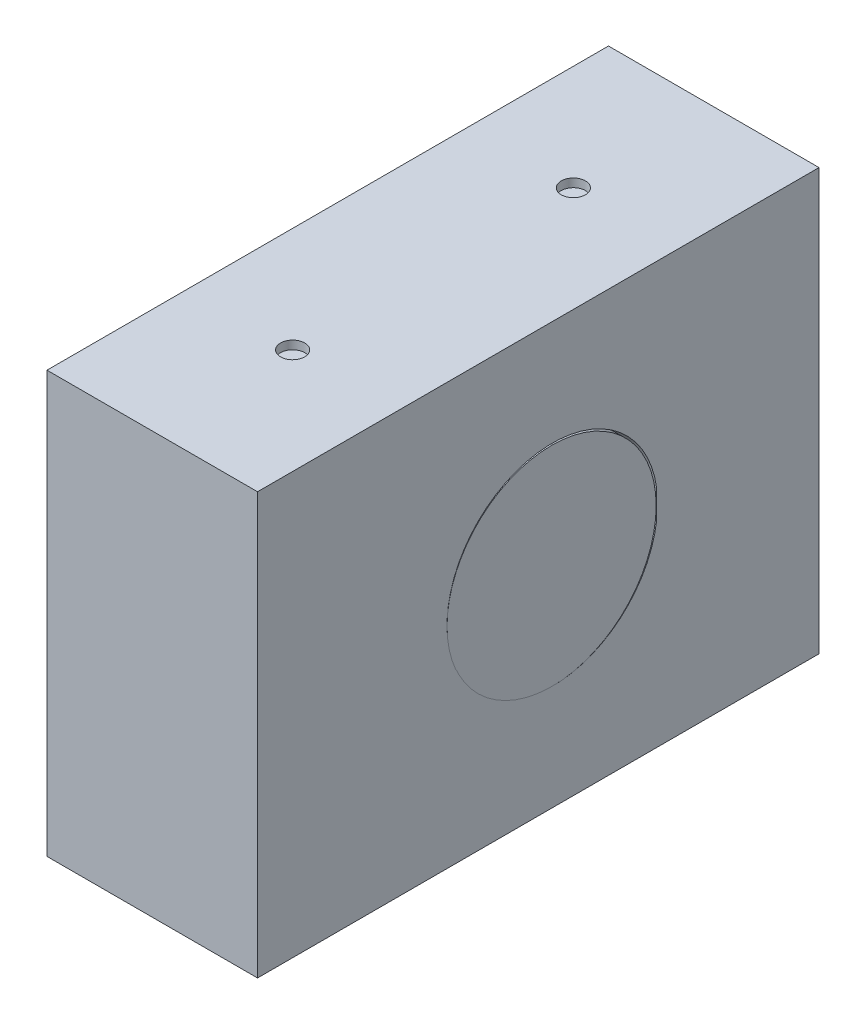
ISO-10303-21;
HEADER;
FILE_DESCRIPTION(('STEP AP214'),'2;1');
FILE_NAME('part.step','',(''),(''),'','','');
FILE_SCHEMA(('AUTOMOTIVE_DESIGN { 1 0 10303 214 1 1 1 1 }'));
ENDSEC;
DATA;
#1=APPLICATION_CONTEXT('core data for automotive mechanical design processes');
#2=APPLICATION_PROTOCOL_DEFINITION('international standard','automotive_design',2000,#1);
#3=PRODUCT_CONTEXT('',#1,'mechanical');
#4=PRODUCT('Part','Part','',(#3));
#5=PRODUCT_RELATED_PRODUCT_CATEGORY('part','',(#4));
#6=PRODUCT_DEFINITION_FORMATION('','',#4);
#7=PRODUCT_DEFINITION_CONTEXT('part definition',#1,'design');
#8=PRODUCT_DEFINITION('design','',#6,#7);
#9=PRODUCT_DEFINITION_SHAPE('','',#8);
#10=(LENGTH_UNIT() NAMED_UNIT(*) SI_UNIT(.MILLI.,.METRE.));
#11=(NAMED_UNIT(*) PLANE_ANGLE_UNIT() SI_UNIT($,.RADIAN.));
#12=(NAMED_UNIT(*) SI_UNIT($,.STERADIAN.) SOLID_ANGLE_UNIT());
#13=UNCERTAINTY_MEASURE_WITH_UNIT(LENGTH_MEASURE(1.E-05),#10,'distance_accuracy_value','');
#14=(GEOMETRIC_REPRESENTATION_CONTEXT(3) GLOBAL_UNCERTAINTY_ASSIGNED_CONTEXT((#13)) GLOBAL_UNIT_ASSIGNED_CONTEXT((#10,
#11,#12)) REPRESENTATION_CONTEXT('',''));
#15=CARTESIAN_POINT('',(0.,0.,0.));
#16=DIRECTION('',(0.,0.,1.));
#17=DIRECTION('',(1.,0.,0.));
#18=AXIS2_PLACEMENT_3D('',#15,#16,#17);
#19=CARTESIAN_POINT('',(19.05,18.9755867559221,-26.6049572799298));
#20=DIRECTION('',(-1.,0.,0.));
#21=DIRECTION('',(0.,0.,1.));
#22=AXIS2_PLACEMENT_3D('',#19,#20,#21);
#23=CYLINDRICAL_SURFACE('',#22,9.45995578753628);
#24=CARTESIAN_POINT('',(19.05,18.9755867559221,-26.6049572799298));
#25=DIRECTION('',(-1.,0.,0.));
#26=DIRECTION('',(0.,0.,1.));
#27=AXIS2_PLACEMENT_3D('',#24,#25,#26);
#28=CIRCLE('',#27,9.45995578753628);
#29=CARTESIAN_POINT('',(19.05,18.9755867559221,-17.1450014923936));
#30=VERTEX_POINT('',#29);
#31=EDGE_CURVE('E11',#30,#30,#28,.T.);
#32=CARTESIAN_POINT('',(0.,18.9755867559221,-26.6049572799298));
#33=DIRECTION('',(-1.,0.,0.));
#34=DIRECTION('',(0.,0.,1.));
#35=AXIS2_PLACEMENT_3D('',#32,#33,#34);
#36=CIRCLE('',#35,9.45995578753628);
#37=CARTESIAN_POINT('',(0.,18.9755867559221,-17.1450014923936));
#38=VERTEX_POINT('',#37);
#39=EDGE_CURVE('E54',#38,#38,#36,.T.);
#40=CARTESIAN_POINT('',(19.05,18.9755867559221,-17.1450014923936));
#41=CARTESIAN_POINT('',(18.8515625,18.9755867559221,-17.1450014923936));
#42=CARTESIAN_POINT('',(18.653125,18.9755867559221,-17.1450014923936));
#43=CARTESIAN_POINT('',(18.25625,18.9755867559221,-17.1450014923936));
#44=CARTESIAN_POINT('',(18.0578125,18.9755867559221,-17.1450014923936));
#45=CARTESIAN_POINT('',(17.6609375,18.9755867559221,-17.1450014923936));
#46=CARTESIAN_POINT('',(17.4625,18.9755867559221,-17.1450014923936));
#47=CARTESIAN_POINT('',(17.065625,18.9755867559221,-17.1450014923936));
#48=CARTESIAN_POINT('',(16.8671875,18.9755867559221,-17.1450014923936));
#49=CARTESIAN_POINT('',(16.4703125,18.9755867559221,-17.1450014923936));
#50=CARTESIAN_POINT('',(16.271875,18.9755867559221,-17.1450014923936));
#51=CARTESIAN_POINT('',(15.875,18.9755867559221,-17.1450014923936));
#52=CARTESIAN_POINT('',(15.6765625,18.9755867559221,-17.1450014923936));
#53=CARTESIAN_POINT('',(15.2796875,18.9755867559221,-17.1450014923936));
#54=CARTESIAN_POINT('',(15.08125,18.9755867559221,-17.1450014923936));
#55=CARTESIAN_POINT('',(14.684375,18.9755867559221,-17.1450014923936));
#56=CARTESIAN_POINT('',(14.4859375,18.9755867559221,-17.1450014923936));
#57=CARTESIAN_POINT('',(14.0890625,18.9755867559221,-17.1450014923936));
#58=CARTESIAN_POINT('',(13.890625,18.9755867559221,-17.1450014923936));
#59=CARTESIAN_POINT('',(13.49375,18.9755867559221,-17.1450014923936));
#60=CARTESIAN_POINT('',(13.2953125,18.9755867559221,-17.1450014923936));
#61=CARTESIAN_POINT('',(12.8984375,18.9755867559221,-17.1450014923936));
#62=CARTESIAN_POINT('',(12.7,18.9755867559221,-17.1450014923936));
#63=CARTESIAN_POINT('',(12.303125,18.9755867559221,-17.1450014923936));
#64=CARTESIAN_POINT('',(12.1046875,18.9755867559221,-17.1450014923936));
#65=CARTESIAN_POINT('',(11.7078125,18.9755867559221,-17.1450014923936));
#66=CARTESIAN_POINT('',(11.509375,18.9755867559221,-17.1450014923936));
#67=CARTESIAN_POINT('',(11.1125,18.9755867559221,-17.1450014923936));
#68=CARTESIAN_POINT('',(10.9140625,18.9755867559221,-17.1450014923936));
#69=CARTESIAN_POINT('',(10.5171875,18.9755867559221,-17.1450014923936));
#70=CARTESIAN_POINT('',(10.31875,18.9755867559221,-17.1450014923936));
#71=CARTESIAN_POINT('',(9.921875,18.9755867559221,-17.1450014923936));
#72=CARTESIAN_POINT('',(9.7234375,18.9755867559221,-17.1450014923936));
#73=CARTESIAN_POINT('',(9.3265625,18.9755867559221,-17.1450014923936));
#74=CARTESIAN_POINT('',(9.128125,18.9755867559221,-17.1450014923936));
#75=CARTESIAN_POINT('',(8.73125,18.9755867559221,-17.1450014923936));
#76=CARTESIAN_POINT('',(8.5328125,18.9755867559221,-17.1450014923936));
#77=CARTESIAN_POINT('',(8.1359375,18.9755867559221,-17.1450014923936));
#78=CARTESIAN_POINT('',(7.9375,18.9755867559221,-17.1450014923936));
#79=CARTESIAN_POINT('',(7.540625,18.9755867559221,-17.1450014923936));
#80=CARTESIAN_POINT('',(7.3421875,18.9755867559221,-17.1450014923936));
#81=CARTESIAN_POINT('',(6.9453125,18.9755867559221,-17.1450014923936));
#82=CARTESIAN_POINT('',(6.746875,18.9755867559221,-17.1450014923936));
#83=CARTESIAN_POINT('',(6.35,18.9755867559221,-17.1450014923936));
#84=CARTESIAN_POINT('',(6.1515625,18.9755867559221,-17.1450014923936));
#85=CARTESIAN_POINT('',(5.7546875,18.9755867559221,-17.1450014923936));
#86=CARTESIAN_POINT('',(5.55625,18.9755867559221,-17.1450014923936));
#87=CARTESIAN_POINT('',(5.159375,18.9755867559221,-17.1450014923936));
#88=CARTESIAN_POINT('',(4.9609375,18.9755867559221,-17.1450014923936));
#89=CARTESIAN_POINT('',(4.5640625,18.9755867559221,-17.1450014923936));
#90=CARTESIAN_POINT('',(4.365625,18.9755867559221,-17.1450014923936));
#91=CARTESIAN_POINT('',(3.96875,18.9755867559221,-17.1450014923936));
#92=CARTESIAN_POINT('',(3.7703125,18.9755867559221,-17.1450014923936));
#93=CARTESIAN_POINT('',(3.3734375,18.9755867559221,-17.1450014923936));
#94=CARTESIAN_POINT('',(3.175,18.9755867559221,-17.1450014923936));
#95=CARTESIAN_POINT('',(2.778125,18.9755867559221,-17.1450014923936));
#96=CARTESIAN_POINT('',(2.5796875,18.9755867559221,-17.1450014923936));
#97=CARTESIAN_POINT('',(2.1828125,18.9755867559221,-17.1450014923936));
#98=CARTESIAN_POINT('',(1.984375,18.9755867559221,-17.1450014923936));
#99=CARTESIAN_POINT('',(1.5875,18.9755867559221,-17.1450014923936));
#100=CARTESIAN_POINT('',(1.3890625,18.9755867559221,-17.1450014923936));
#101=CARTESIAN_POINT('',(0.992187500000001,18.9755867559221,-17.1450014923936));
#102=CARTESIAN_POINT('',(0.793750000000001,18.9755867559221,-17.1450014923936));
#103=CARTESIAN_POINT('',(0.396875,18.9755867559221,-17.1450014923936));
#104=CARTESIAN_POINT('',(0.1984375,18.9755867559221,-17.1450014923936));
#105=CARTESIAN_POINT('',(0.,18.9755867559221,-17.1450014923936));
#106=B_SPLINE_CURVE_WITH_KNOTS('',3,(#40,#41,#42,#43,#44,#45,#46,#47,#48,#49,#50,#51,#52,#53,
#54,#55,#56,#57,#58,#59,#60,#61,#62,#63,#64,#65,#66,#67,#68,#69,#70,#71,#72,#73,#74,#75,#76,#77,
#78,#79,#80,#81,#82,#83,#84,#85,#86,#87,#88,#89,#90,#91,#92,#93,#94,#95,#96,#97,#98,#99,#100,
#101,#102,#103,#104,#105),.UNSPECIFIED.,.F.,.F.,(4,2,2,2,2,2,2,2,2,2,2,2,2,2,2,2,2,2,2,2,2,2,2,
2,2,2,2,2,2,2,2,2,4),(0.,0.595312499999997,1.190625,1.7859375,2.38125,2.9765625,3.571875,
4.1671875,4.7625,5.3578125,5.953125,6.5484375,7.14375,7.7390625,8.334375,8.9296875,9.525,
10.1203125,10.715625,11.3109375,11.90625,12.5015625,13.096875,13.6921875,14.2875,14.8828125,
15.478125,16.0734375,16.66875,17.2640625,17.859375,18.4546875,19.05),.UNSPECIFIED.);
#107=EDGE_CURVE('BSEAM51',#30,#38,#106,.T.);
#108=ORIENTED_EDGE('',*,*,#31,.T.);
#109=ORIENTED_EDGE('',*,*,#39,.F.);
#110=ORIENTED_EDGE('',*,*,#107,.T.);
#111=ORIENTED_EDGE('',*,*,#107,.F.);
#112=EDGE_LOOP('',(#108,#110,#109,#111));
#113=FACE_BOUND('',#112,.T.);
#114=ADVANCED_FACE('F51',(#113),#23,.T.);
#115=CARTESIAN_POINT('',(19.05,18.9755867559221,-26.6049572799298));
#116=DIRECTION('',(-1.,0.,0.));
#117=DIRECTION('',(0.,0.,1.));
#118=AXIS2_PLACEMENT_3D('',#115,#116,#117);
#119=PLANE('',#118);
#120=ORIENTED_EDGE('',*,*,#31,.F.);
#121=EDGE_LOOP('',(#120));
#122=FACE_BOUND('',#121,.T.);
#123=ADVANCED_FACE('F66',(#122),#119,.F.);
#124=CARTESIAN_POINT('',(0.,18.9755867559221,-26.6049572799298));
#125=DIRECTION('',(-1.,0.,0.));
#126=DIRECTION('',(0.,0.,1.));
#127=AXIS2_PLACEMENT_3D('',#124,#125,#126);
#128=PLANE('',#127);
#129=ORIENTED_EDGE('',*,*,#39,.T.);
#130=EDGE_LOOP('',(#129));
#131=FACE_BOUND('',#130,.T.);
#132=ADVANCED_FACE('F63',(#131),#128,.T.);
#133=CLOSED_SHELL('',(#114,#123,#132));
#134=MANIFOLD_SOLID_BREP('B2',#133);
#135=CARTESIAN_POINT('',(19.05,38.1,0.));
#136=DIRECTION('',(0.,-1.,0.));
#137=DIRECTION('',(0.,0.,-1.));
#138=AXIS2_PLACEMENT_3D('',#135,#136,#137);
#139=PLANE('',#138);
#140=DIRECTION('',(0.,0.,1.));
#141=VECTOR('',#140,1.);
#142=CARTESIAN_POINT('',(0.,38.1,0.));
#143=LINE('',#142,#141);
#144=CARTESIAN_POINT('',(0.,38.1,-50.8));
#145=VERTEX_POINT('',#144);
#146=CARTESIAN_POINT('',(0.,38.1,0.));
#147=VERTEX_POINT('',#146);
#148=EDGE_CURVE('E146',#145,#147,#143,.T.);
#149=ORIENTED_EDGE('',*,*,#148,.T.);
#150=DIRECTION('',(-1.,0.,0.));
#151=VECTOR('',#150,1.);
#152=CARTESIAN_POINT('',(19.05,38.1,0.));
#153=LINE('',#152,#151);
#154=CARTESIAN_POINT('',(19.05,38.1,0.));
#155=VERTEX_POINT('',#154);
#156=EDGE_CURVE('E235',#155,#147,#153,.T.);
#157=ORIENTED_EDGE('',*,*,#156,.F.);
#158=DIRECTION('',(0.,0.,1.));
#159=VECTOR('',#158,1.);
#160=CARTESIAN_POINT('',(19.05,38.1,0.));
#161=LINE('',#160,#159);
#162=CARTESIAN_POINT('',(19.05,38.1,-50.8));
#163=VERTEX_POINT('',#162);
#164=EDGE_CURVE('E122',#163,#155,#161,.T.);
#165=ORIENTED_EDGE('',*,*,#164,.F.);
#166=DIRECTION('',(-1.,0.,0.));
#167=VECTOR('',#166,1.);
#168=CARTESIAN_POINT('',(19.05,38.1,-50.8));
#169=LINE('',#168,#167);
#170=EDGE_CURVE('E186',#163,#145,#169,.T.);
#171=ORIENTED_EDGE('',*,*,#170,.T.);
#172=EDGE_LOOP('',(#149,#157,#165,#171));
#173=FACE_BOUND('',#172,.T.);
#174=CARTESIAN_POINT('',(9.525,38.1,-38.1));
#175=DIRECTION('',(0.,-1.,0.));
#176=DIRECTION('',(0.,0.,-1.));
#177=AXIS2_PLACEMENT_3D('',#174,#175,#176);
#178=CIRCLE('',#177,1.0922);
#179=CARTESIAN_POINT('',(9.525,38.1,-37.0078));
#180=VERTEX_POINT('',#179);
#181=EDGE_CURVE('E366',#180,#180,#178,.T.);
#182=ORIENTED_EDGE('',*,*,#181,.T.);
#183=EDGE_LOOP('',(#182));
#184=FACE_BOUND('',#183,.T.);
#185=CARTESIAN_POINT('',(9.525,38.1,-12.7));
#186=DIRECTION('',(0.,1.,0.));
#187=DIRECTION('',(0.,0.,1.));
#188=AXIS2_PLACEMENT_3D('',#185,#186,#187);
#189=CIRCLE('',#188,1.0922);
#190=CARTESIAN_POINT('',(9.525,38.1,-11.6078));
#191=VERTEX_POINT('',#190);
#192=EDGE_CURVE('E362',#191,#191,#189,.T.);
#193=ORIENTED_EDGE('',*,*,#192,.F.);
#194=EDGE_LOOP('',(#193));
#195=FACE_BOUND('',#194,.T.);
#196=ADVANCED_FACE('F92',(#173,#184,#195),#139,.F.);
#197=CARTESIAN_POINT('',(19.05,0.,0.));
#198=DIRECTION('',(0.,0.,-1.));
#199=DIRECTION('',(-1.,0.,0.));
#200=AXIS2_PLACEMENT_3D('',#197,#198,#199);
#201=PLANE('',#200);
#202=DIRECTION('',(0.,-1.,0.));
#203=VECTOR('',#202,1.);
#204=CARTESIAN_POINT('',(0.,0.,0.));
#205=LINE('',#204,#203);
#206=CARTESIAN_POINT('',(0.,0.,0.));
#207=VERTEX_POINT('',#206);
#208=EDGE_CURVE('E225',#147,#207,#205,.T.);
#209=ORIENTED_EDGE('',*,*,#208,.T.);
#210=DIRECTION('',(-1.,0.,0.));
#211=VECTOR('',#210,1.);
#212=CARTESIAN_POINT('',(19.05,0.,0.));
#213=LINE('',#212,#211);
#214=CARTESIAN_POINT('',(19.05,0.,0.));
#215=VERTEX_POINT('',#214);
#216=EDGE_CURVE('E260',#215,#207,#213,.T.);
#217=ORIENTED_EDGE('',*,*,#216,.F.);
#218=DIRECTION('',(0.,-1.,0.));
#219=VECTOR('',#218,1.);
#220=CARTESIAN_POINT('',(19.05,0.,0.));
#221=LINE('',#220,#219);
#222=EDGE_CURVE('E226',#155,#215,#221,.T.);
#223=ORIENTED_EDGE('',*,*,#222,.F.);
#224=ORIENTED_EDGE('',*,*,#156,.T.);
#225=EDGE_LOOP('',(#209,#217,#223,#224));
#226=FACE_BOUND('',#225,.T.);
#227=ADVANCED_FACE('F94',(#226),#201,.F.);
#228=CARTESIAN_POINT('',(19.05,0.,0.));
#229=DIRECTION('',(0.,1.,0.));
#230=DIRECTION('',(0.,0.,1.));
#231=AXIS2_PLACEMENT_3D('',#228,#229,#230);
#232=PLANE('',#231);
#233=CARTESIAN_POINT('',(9.525,0.,-12.7));
#234=DIRECTION('',(0.,-1.,0.));
#235=DIRECTION('',(0.,0.,-1.));
#236=AXIS2_PLACEMENT_3D('',#233,#234,#235);
#237=CIRCLE('',#236,3.1877);
#238=CARTESIAN_POINT('',(9.525,0.,-15.8877));
#239=VERTEX_POINT('',#238);
#240=EDGE_CURVE('E190',#239,#239,#237,.T.);
#241=ORIENTED_EDGE('',*,*,#240,.F.);
#242=EDGE_LOOP('',(#241));
#243=FACE_BOUND('',#242,.T.);
#244=CARTESIAN_POINT('',(9.525,0.,-38.1));
#245=DIRECTION('',(0.,-1.,0.));
#246=DIRECTION('',(0.,0.,-1.));
#247=AXIS2_PLACEMENT_3D('',#244,#245,#246);
#248=CIRCLE('',#247,3.1877);
#249=CARTESIAN_POINT('',(9.525,0.,-41.2877));
#250=VERTEX_POINT('',#249);
#251=EDGE_CURVE('E211',#250,#250,#248,.T.);
#252=ORIENTED_EDGE('',*,*,#251,.F.);
#253=EDGE_LOOP('',(#252));
#254=FACE_BOUND('',#253,.T.);
#255=DIRECTION('',(0.,0.,-1.));
#256=VECTOR('',#255,1.);
#257=CARTESIAN_POINT('',(0.,0.,0.));
#258=LINE('',#257,#256);
#259=CARTESIAN_POINT('',(0.,0.,-50.8));
#260=VERTEX_POINT('',#259);
#261=EDGE_CURVE('E239',#207,#260,#258,.T.);
#262=ORIENTED_EDGE('',*,*,#261,.T.);
#263=DIRECTION('',(-1.,0.,0.));
#264=VECTOR('',#263,1.);
#265=CARTESIAN_POINT('',(19.05,0.,-50.8));
#266=LINE('',#265,#264);
#267=CARTESIAN_POINT('',(19.05,0.,-50.8));
#268=VERTEX_POINT('',#267);
#269=EDGE_CURVE('E256',#268,#260,#266,.T.);
#270=ORIENTED_EDGE('',*,*,#269,.F.);
#271=DIRECTION('',(0.,0.,-1.));
#272=VECTOR('',#271,1.);
#273=CARTESIAN_POINT('',(19.05,0.,0.));
#274=LINE('',#273,#272);
#275=EDGE_CURVE('E155',#215,#268,#274,.T.);
#276=ORIENTED_EDGE('',*,*,#275,.F.);
#277=ORIENTED_EDGE('',*,*,#216,.T.);
#278=EDGE_LOOP('',(#262,#270,#276,#277));
#279=FACE_BOUND('',#278,.T.);
#280=ADVANCED_FACE('F296',(#243,#254,#279),#232,.F.);
#281=CARTESIAN_POINT('',(19.05,19.05,-26.67));
#282=DIRECTION('',(-1.,0.,0.));
#283=DIRECTION('',(0.,0.,1.));
#284=AXIS2_PLACEMENT_3D('',#281,#282,#283);
#285=CYLINDRICAL_SURFACE('',#284,9.525);
#286=CARTESIAN_POINT('',(10.7308920202739,16.51,-35.8500885071986));
#287=CARTESIAN_POINT('',(10.7105449153327,16.4705969002441,-35.8391871014875));
#288=CARTESIAN_POINT('',(10.6892986513937,16.4316996887252,-35.828150452014));
#289=CARTESIAN_POINT('',(10.6448090458278,16.355063803279,-35.8058927810139));
#290=CARTESIAN_POINT('',(10.6215636439895,16.317326380257,-35.7946715791628));
#291=CARTESIAN_POINT('',(10.5476826159067,16.2048050636838,-35.7604723970457));
#292=CARTESIAN_POINT('',(10.4936524551483,16.1322088825551,-35.7373760651035));
#293=CARTESIAN_POINT('',(10.3748781318391,15.9950235369091,-35.6920835063758));
#294=CARTESIAN_POINT('',(10.3100674617545,15.9304887254985,-35.6698940043106));
#295=CARTESIAN_POINT('',(10.1691997406349,15.8145135317944,-35.628850495012));
#296=CARTESIAN_POINT('',(10.0932392830294,15.762970099605,-35.6099706250648));
#297=CARTESIAN_POINT('',(9.96254605126018,15.6948942123904,-35.5845757563927));
#298=CARTESIAN_POINT('',(9.91121123425133,15.6725644808902,-35.5761178825242));
#299=CARTESIAN_POINT('',(9.80528649439631,15.6360211443815,-35.5621739131686));
#300=CARTESIAN_POINT('',(9.75069711869299,15.6218061793777,-35.5566873197175));
#301=CARTESIAN_POINT('',(9.63934672935266,15.6025856339192,-35.5492495295827));
#302=CARTESIAN_POINT('',(9.58257557363576,15.5976302404454,-35.5473176000773));
#303=CARTESIAN_POINT('',(9.46902182206461,15.5975402926848,-35.5472826498138));
#304=CARTESIAN_POINT('',(9.41223922660471,15.6024054437355,-35.549179514174));
#305=CARTESIAN_POINT('',(9.30482553651737,15.6207688460585,-35.5562861390273));
#306=CARTESIAN_POINT('',(9.25405565144409,15.6335800743525,-35.5612320848831));
#307=CARTESIAN_POINT('',(9.1552563612655,15.666280875207,-35.5737281263264));
#308=CARTESIAN_POINT('',(9.10722594531658,15.6861678170181,-35.5812772540192));
#309=CARTESIAN_POINT('',(8.99487086083253,15.7416352885214,-35.6020517472602));
#310=CARTESIAN_POINT('',(8.93226514826073,15.7802950383586,-35.6163268928976));
#311=CARTESIAN_POINT('',(8.81413826232632,15.8668983147816,-35.6475060227413));
#312=CARTESIAN_POINT('',(8.75866631693088,15.9149011450332,-35.664426656111));
#313=CARTESIAN_POINT('',(8.66655989092835,16.0059886433841,-35.6955966769742));
#314=CARTESIAN_POINT('',(8.62849625449501,16.047747015902,-35.7095896761785));
#315=CARTESIAN_POINT('',(8.55627308578193,16.1344782411324,-35.7379347845873));
#316=CARTESIAN_POINT('',(8.52211847251568,16.179455030683,-35.752287319146));
#317=CARTESIAN_POINT('',(8.45802859632586,16.2710338031751,-35.7807202539161));
#318=CARTESIAN_POINT('',(8.42802585494137,16.3175890797189,-35.7948006767651));
#319=CARTESIAN_POINT('',(8.37125561002602,16.4125162056318,-35.8226917838961));
#320=CARTESIAN_POINT('',(8.34447876429064,16.4608822503531,-35.83650314499));
#321=CARTESIAN_POINT('',(8.31910797972602,16.5099999999999,-35.8500885071986));
#322=B_SPLINE_CURVE_WITH_KNOTS('',3,(#286,#287,#288,#289,#290,#291,#292,#293,#294,#295,#296,
#297,#298,#299,#300,#301,#302,#303,#304,#305,#306,#307,#308,#309,#310,#311,#312,#313,#314,#315,
#316,#317,#318,#319,#320,#321),.UNSPECIFIED.,.F.,.F.,(4,2,2,2,2,2,2,2,2,2,2,2,2,2,2,2,2,4),(0.,
0.136974543961864,0.274091978472904,0.553477483229319,0.834655264779522,1.11352704048746,
1.2827412087585,1.45192700923051,1.62202716826669,1.79212222357548,1.94923913447418,
2.1062976902658,2.32990407542057,2.55497899389256,2.72937512370454,2.90398835071514,
3.07530537535424,3.24611368934331),.UNSPECIFIED.);
#323=CARTESIAN_POINT('',(10.7308920202739,16.51,-35.8500885071986));
#324=VERTEX_POINT('',#323);
#325=CARTESIAN_POINT('',(8.31910797972613,16.51,-35.8500885071986));
#326=VERTEX_POINT('',#325);
#327=EDGE_CURVE('E107',#324,#326,#322,.T.);
#328=ORIENTED_EDGE('',*,*,#327,.T.);
#329=CARTESIAN_POINT('',(7.90479333158751,16.3564183097808,-35.8062050479461));
#330=CARTESIAN_POINT('',(7.96414185924864,16.380465934675,-35.813295636295));
#331=CARTESIAN_POINT('',(8.02379400147821,16.4038516418221,-35.8200862292294));
#332=CARTESIAN_POINT('',(8.14379887019458,16.4490297322675,-35.8330305489717));
#333=CARTESIAN_POINT('',(8.20415192184958,16.4708213387699,-35.8391839658862));
#334=CARTESIAN_POINT('',(8.38706712834756,16.533624101917,-35.8566951004348));
#335=CARTESIAN_POINT('',(8.51075246937379,16.5717584799006,-35.8670148992511));
#336=CARTESIAN_POINT('',(8.75861081999487,16.6366369804776,-35.8842508112363));
#337=CARTESIAN_POINT('',(8.88271932328196,16.6636029982894,-35.8912337042493));
#338=CARTESIAN_POINT('',(9.13302383241327,16.7039928396561,-35.9015940125067));
#339=CARTESIAN_POINT('',(9.25921312665588,16.7174538568834,-35.9049813317044));
#340=CARTESIAN_POINT('',(9.50982545619499,16.7286795082022,-35.9078101481385));
#341=CARTESIAN_POINT('',(9.63423306957354,16.7267539351251,-35.9073295209986));
#342=CARTESIAN_POINT('',(9.88197830865542,16.7082610255079,-35.9026573374453));
#343=CARTESIAN_POINT('',(10.0053144684998,16.6916760924657,-35.8984613212187));
#344=CARTESIAN_POINT('',(10.2495977630408,16.6462519830918,-35.886732387456));
#345=CARTESIAN_POINT('',(10.3705418725876,16.6173982133063,-35.8791954955825));
#346=CARTESIAN_POINT('',(10.6095372807927,16.5504748290061,-35.8612562292133));
#347=CARTESIAN_POINT('',(10.727589179234,16.5124071433846,-35.8508544544054));
#348=CARTESIAN_POINT('',(10.8950236851132,16.4530300819019,-35.8341543356637));
#349=CARTESIAN_POINT('',(10.9454935063193,16.4344148899139,-35.8288611108426));
#350=CARTESIAN_POINT('',(11.0457806252145,16.3961586152824,-35.8178492549953));
#351=CARTESIAN_POINT('',(11.0955996461777,16.3765215827296,-35.8121322702181));
#352=CARTESIAN_POINT('',(11.1452066684125,16.3564183097808,-35.8062050479461));
#353=B_SPLINE_CURVE_WITH_KNOTS('',3,(#329,#330,#331,#332,#333,#334,#335,#336,#337,#338,#339,
#340,#341,#342,#343,#344,#345,#346,#347,#348,#349,#350,#351,#352),.UNSPECIFIED.,.F.,.F.,(4,2,2,
2,2,2,2,2,2,2,2,4),(0.,0.19327047347728,0.386634507688743,0.775754561484849,1.1567222862283,
1.53663789627088,1.9089238727048,2.28165733394404,2.65483539742319,3.02793540516608,
3.19008519955114,3.35163511587624),.UNSPECIFIED.);
#354=EDGE_CURVE('E49',#326,#324,#353,.T.);
#355=ORIENTED_EDGE('',*,*,#354,.T.);
#356=EDGE_LOOP('',(#328,#355));
#357=FACE_BOUND('',#356,.T.);
#358=CARTESIAN_POINT('',(0.,19.05,-26.67));
#359=DIRECTION('',(-1.,0.,0.));
#360=DIRECTION('',(0.,0.,-1.));
#361=AXIS2_PLACEMENT_3D('',#358,#359,#360);
#362=CIRCLE('',#361,9.525);
#363=CARTESIAN_POINT('',(0.,17.78,-36.1099536545472));
#364=VERTEX_POINT('',#363);
#365=CARTESIAN_POINT('',(0.,20.32,-36.1099536545472));
#366=VERTEX_POINT('',#365);
#367=EDGE_CURVE('E180',#364,#366,#362,.T.);
#368=ORIENTED_EDGE('',*,*,#367,.T.);
#369=DIRECTION('',(-1.,0.,0.));
#370=VECTOR('',#369,1.);
#371=CARTESIAN_POINT('',(19.05,20.32,-36.1099536545472));
#372=LINE('',#371,#370);
#373=CARTESIAN_POINT('',(19.05,20.32,-36.1099536545472));
#374=VERTEX_POINT('',#373);
#375=EDGE_CURVE('E177',#374,#366,#372,.T.);
#376=ORIENTED_EDGE('',*,*,#375,.F.);
#377=CARTESIAN_POINT('',(19.05,19.05,-26.67));
#378=DIRECTION('',(-1.,0.,0.));
#379=DIRECTION('',(0.,0.,-1.));
#380=AXIS2_PLACEMENT_3D('',#377,#378,#379);
#381=CIRCLE('',#380,9.525);
#382=CARTESIAN_POINT('',(19.05,17.78,-36.1099536545472));
#383=VERTEX_POINT('',#382);
#384=EDGE_CURVE('E165',#383,#374,#381,.T.);
#385=ORIENTED_EDGE('',*,*,#384,.F.);
#386=DIRECTION('',(-1.,0.,0.));
#387=VECTOR('',#386,1.);
#388=CARTESIAN_POINT('',(19.05,17.78,-36.1099536545472));
#389=LINE('',#388,#387);
#390=EDGE_CURVE('E185',#383,#364,#389,.T.);
#391=ORIENTED_EDGE('',*,*,#390,.T.);
#392=EDGE_LOOP('',(#368,#376,#385,#391));
#393=FACE_BOUND('',#392,.T.);
#394=ADVANCED_FACE('F178',(#357,#393),#285,.F.);
#395=CARTESIAN_POINT('',(19.05,20.32,-50.8));
#396=DIRECTION('',(0.,0.,1.));
#397=DIRECTION('',(1.,0.,0.));
#398=AXIS2_PLACEMENT_3D('',#395,#396,#397);
#399=PLANE('',#398);
#400=DIRECTION('',(0.,1.,0.));
#401=VECTOR('',#400,1.);
#402=CARTESIAN_POINT('',(0.,20.32,-50.8));
#403=LINE('',#402,#401);
#404=EDGE_CURVE('E245',#260,#145,#403,.T.);
#405=ORIENTED_EDGE('',*,*,#404,.T.);
#406=ORIENTED_EDGE('',*,*,#170,.F.);
#407=DIRECTION('',(0.,1.,0.));
#408=VECTOR('',#407,1.);
#409=CARTESIAN_POINT('',(19.05,0.,-50.8));
#410=LINE('',#409,#408);
#411=EDGE_CURVE('E174',#268,#163,#410,.T.);
#412=ORIENTED_EDGE('',*,*,#411,.F.);
#413=ORIENTED_EDGE('',*,*,#269,.T.);
#414=EDGE_LOOP('',(#405,#406,#412,#413));
#415=FACE_BOUND('',#414,.T.);
#416=ADVANCED_FACE('F286',(#415),#399,.F.);
#417=CARTESIAN_POINT('',(19.05,19.05,-26.67));
#418=DIRECTION('',(1.,0.,0.));
#419=DIRECTION('',(0.,0.,-1.));
#420=AXIS2_PLACEMENT_3D('',#417,#418,#419);
#421=PLANE('',#420);
#422=ORIENTED_EDGE('',*,*,#411,.T.);
#423=ORIENTED_EDGE('',*,*,#164,.T.);
#424=ORIENTED_EDGE('',*,*,#222,.T.);
#425=ORIENTED_EDGE('',*,*,#275,.T.);
#426=EDGE_LOOP('',(#422,#423,#424,#425));
#427=FACE_BOUND('',#426,.T.);
#428=ORIENTED_EDGE('',*,*,#384,.T.);
#429=DIRECTION('',(0.,1.,0.));
#430=VECTOR('',#429,1.);
#431=CARTESIAN_POINT('',(19.05,20.32,-36.1099536545472));
#432=LINE('',#431,#430);
#433=EDGE_CURVE('E169',#383,#374,#432,.T.);
#434=ORIENTED_EDGE('',*,*,#433,.F.);
#435=EDGE_LOOP('',(#428,#434));
#436=FACE_BOUND('',#435,.T.);
#437=ADVANCED_FACE('F167',(#427,#436),#421,.T.);
#438=CARTESIAN_POINT('',(0.,19.05,-26.67));
#439=DIRECTION('',(1.,0.,0.));
#440=DIRECTION('',(0.,0.,-1.));
#441=AXIS2_PLACEMENT_3D('',#438,#439,#440);
#442=PLANE('',#441);
#443=ORIENTED_EDGE('',*,*,#404,.F.);
#444=ORIENTED_EDGE('',*,*,#261,.F.);
#445=ORIENTED_EDGE('',*,*,#208,.F.);
#446=ORIENTED_EDGE('',*,*,#148,.F.);
#447=EDGE_LOOP('',(#443,#444,#445,#446));
#448=FACE_BOUND('',#447,.T.);
#449=DIRECTION('',(0.,1.,0.));
#450=VECTOR('',#449,1.);
#451=CARTESIAN_POINT('',(0.,20.32,-36.1099536545472));
#452=LINE('',#451,#450);
#453=EDGE_CURVE('E191',#364,#366,#452,.T.);
#454=ORIENTED_EDGE('',*,*,#453,.T.);
#455=ORIENTED_EDGE('',*,*,#367,.F.);
#456=EDGE_LOOP('',(#454,#455));
#457=FACE_BOUND('',#456,.T.);
#458=ADVANCED_FACE('F282',(#448,#457),#442,.F.);
#459=CARTESIAN_POINT('',(9.525,16.51,-38.1));
#460=DIRECTION('',(0.,-1.,0.));
#461=DIRECTION('',(0.,0.,-1.));
#462=AXIS2_PLACEMENT_3D('',#459,#460,#461);
#463=CONICAL_SURFACE('',#462,2.55269999999999,1.02974425867665);
#464=CARTESIAN_POINT('',(9.525,16.51,-38.1));
#465=DIRECTION('',(0.,-1.,0.));
#466=DIRECTION('',(0.,0.,-1.));
#467=AXIS2_PLACEMENT_3D('',#464,#465,#466);
#468=CIRCLE('',#467,2.55269999999999);
#469=EDGE_CURVE('E113',#326,#324,#468,.T.);
#470=ORIENTED_EDGE('',*,*,#469,.T.);
#471=ORIENTED_EDGE('',*,*,#354,.F.);
#472=EDGE_LOOP('',(#470,#471));
#473=FACE_BOUND('',#472,.T.);
#474=CARTESIAN_POINT('',(9.525,17.78,-38.1));
#475=DIRECTION('',(0.,-1.,0.));
#476=DIRECTION('',(0.,0.,-1.));
#477=AXIS2_PLACEMENT_3D('',#474,#475,#476);
#478=CIRCLE('',#477,0.439065057414835);
#479=CARTESIAN_POINT('',(9.525,17.78,-38.5390650574148));
#480=VERTEX_POINT('',#479);
#481=EDGE_CURVE('E221',#480,#480,#478,.T.);
#482=ORIENTED_EDGE('',*,*,#481,.F.);
#483=EDGE_LOOP('',(#482));
#484=FACE_BOUND('',#483,.T.);
#485=ADVANCED_FACE('F276',(#473,#484),#463,.F.);
#486=CARTESIAN_POINT('',(9.525,0.,-38.1));
#487=DIRECTION('',(0.,-1.,0.));
#488=DIRECTION('',(0.,0.,-1.));
#489=AXIS2_PLACEMENT_3D('',#486,#487,#488);
#490=CYLINDRICAL_SURFACE('',#489,2.55269999999999);
#491=CARTESIAN_POINT('',(9.525,0.635000000000004,-38.1));
#492=DIRECTION('',(0.,-1.,0.));
#493=DIRECTION('',(0.,0.,-1.));
#494=AXIS2_PLACEMENT_3D('',#491,#492,#493);
#495=CIRCLE('',#494,2.5527);
#496=CARTESIAN_POINT('',(9.525,0.635000000000004,-40.6527));
#497=VERTEX_POINT('',#496);
#498=EDGE_CURVE('E215',#497,#497,#495,.T.);
#499=ORIENTED_EDGE('',*,*,#498,.T.);
#500=EDGE_LOOP('',(#499));
#501=FACE_BOUND('',#500,.T.);
#502=ORIENTED_EDGE('',*,*,#469,.F.);
#503=ORIENTED_EDGE('',*,*,#327,.F.);
#504=EDGE_LOOP('',(#502,#503));
#505=FACE_BOUND('',#504,.T.);
#506=ADVANCED_FACE('F271',(#501,#505),#490,.F.);
#507=CARTESIAN_POINT('',(9.525,0.,-38.1));
#508=DIRECTION('',(0.,-1.,0.));
#509=DIRECTION('',(0.,0.,-1.));
#510=AXIS2_PLACEMENT_3D('',#507,#508,#509);
#511=CONICAL_SURFACE('',#510,3.1877,0.785398163397446);
#512=ORIENTED_EDGE('',*,*,#498,.F.);
#513=EDGE_LOOP('',(#512));
#514=FACE_BOUND('',#513,.T.);
#515=ORIENTED_EDGE('',*,*,#251,.T.);
#516=EDGE_LOOP('',(#515));
#517=FACE_BOUND('',#516,.T.);
#518=ADVANCED_FACE('F275',(#514,#517),#511,.F.);
#519=CARTESIAN_POINT('',(9.525,16.51,-12.7));
#520=DIRECTION('',(0.,-1.,0.));
#521=DIRECTION('',(0.,0.,-1.));
#522=AXIS2_PLACEMENT_3D('',#519,#520,#521);
#523=CONICAL_SURFACE('',#522,2.55269999999999,1.02974425867665);
#524=CARTESIAN_POINT('',(9.525,18.0438169021916,-12.7));
#525=VERTEX_POINT('',#524);
#526=VERTEX_LOOP('',#525);
#527=FACE_BOUND('',#526,.T.);
#528=CARTESIAN_POINT('',(9.525,16.51,-12.7));
#529=DIRECTION('',(0.,-1.,0.));
#530=DIRECTION('',(0.,0.,-1.));
#531=AXIS2_PLACEMENT_3D('',#528,#529,#530);
#532=CIRCLE('',#531,2.55269999999999);
#533=CARTESIAN_POINT('',(9.525,16.51,-15.2527));
#534=VERTEX_POINT('',#533);
#535=EDGE_CURVE('E207',#534,#534,#532,.T.);
#536=ORIENTED_EDGE('',*,*,#535,.T.);
#537=EDGE_LOOP('',(#536));
#538=FACE_BOUND('',#537,.T.);
#539=ADVANCED_FACE('F316',(#527,#538),#523,.F.);
#540=CARTESIAN_POINT('',(9.525,0.,-12.7));
#541=DIRECTION('',(0.,-1.,0.));
#542=DIRECTION('',(0.,0.,-1.));
#543=AXIS2_PLACEMENT_3D('',#540,#541,#542);
#544=CYLINDRICAL_SURFACE('',#543,2.55269999999999);
#545=ORIENTED_EDGE('',*,*,#535,.F.);
#546=EDGE_LOOP('',(#545));
#547=FACE_BOUND('',#546,.T.);
#548=CARTESIAN_POINT('',(9.525,0.635000000000004,-12.7));
#549=DIRECTION('',(0.,-1.,0.));
#550=DIRECTION('',(0.,0.,-1.));
#551=AXIS2_PLACEMENT_3D('',#548,#549,#550);
#552=CIRCLE('',#551,2.5527);
#553=CARTESIAN_POINT('',(9.525,0.635000000000004,-15.2527));
#554=VERTEX_POINT('',#553);
#555=EDGE_CURVE('E196',#554,#554,#552,.T.);
#556=ORIENTED_EDGE('',*,*,#555,.T.);
#557=EDGE_LOOP('',(#556));
#558=FACE_BOUND('',#557,.T.);
#559=ADVANCED_FACE('F321',(#547,#558),#544,.F.);
#560=CARTESIAN_POINT('',(9.525,0.,-12.7));
#561=DIRECTION('',(0.,-1.,0.));
#562=DIRECTION('',(0.,0.,-1.));
#563=AXIS2_PLACEMENT_3D('',#560,#561,#562);
#564=CONICAL_SURFACE('',#563,3.1877,0.785398163397446);
#565=ORIENTED_EDGE('',*,*,#555,.F.);
#566=EDGE_LOOP('',(#565));
#567=FACE_BOUND('',#566,.T.);
#568=ORIENTED_EDGE('',*,*,#240,.T.);
#569=EDGE_LOOP('',(#568));
#570=FACE_BOUND('',#569,.T.);
#571=ADVANCED_FACE('F327',(#567,#570),#564,.F.);
#572=CARTESIAN_POINT('',(19.05,17.78,-50.8));
#573=DIRECTION('',(0.,-1.,0.));
#574=DIRECTION('',(0.,0.,-1.));
#575=AXIS2_PLACEMENT_3D('',#572,#573,#574);
#576=PLANE('',#575);
#577=ORIENTED_EDGE('',*,*,#481,.T.);
#578=EDGE_LOOP('',(#577));
#579=FACE_BOUND('',#578,.T.);
#580=ADVANCED_FACE('F335',(#579),#576,.T.);
#581=CARTESIAN_POINT('',(19.05,20.32,-36.1099536545472));
#582=DIRECTION('',(0.,0.,1.));
#583=DIRECTION('',(1.,0.,0.));
#584=AXIS2_PLACEMENT_3D('',#581,#582,#583);
#585=PLANE('',#584);
#586=ORIENTED_EDGE('',*,*,#453,.F.);
#587=ORIENTED_EDGE('',*,*,#390,.F.);
#588=ORIENTED_EDGE('',*,*,#433,.T.);
#589=ORIENTED_EDGE('',*,*,#375,.T.);
#590=EDGE_LOOP('',(#586,#587,#588,#589));
#591=FACE_BOUND('',#590,.T.);
#592=ADVANCED_FACE('F188',(#591),#585,.T.);
#593=CARTESIAN_POINT('',(9.525,37.338,-38.1));
#594=DIRECTION('',(0.,1.,0.));
#595=DIRECTION('',(0.,0.,1.));
#596=AXIS2_PLACEMENT_3D('',#593,#594,#595);
#597=CYLINDRICAL_SURFACE('',#596,1.0922);
#598=CARTESIAN_POINT('',(9.525,37.338,-38.1));
#599=DIRECTION('',(0.,-1.,0.));
#600=DIRECTION('',(0.,0.,-1.));
#601=AXIS2_PLACEMENT_3D('',#598,#599,#600);
#602=CIRCLE('',#601,1.0922);
#603=CARTESIAN_POINT('',(9.525,37.338,-37.0078));
#604=VERTEX_POINT('',#603);
#605=EDGE_CURVE('E201',#604,#604,#602,.T.);
#606=CARTESIAN_POINT('',(9.525,37.338,-37.0078));
#607=CARTESIAN_POINT('',(9.525,37.3459375,-37.0078));
#608=CARTESIAN_POINT('',(9.525,37.353875,-37.0078));
#609=CARTESIAN_POINT('',(9.525,37.36975,-37.0078));
#610=CARTESIAN_POINT('',(9.525,37.3776875,-37.0078));
#611=CARTESIAN_POINT('',(9.525,37.3935625,-37.0078));
#612=CARTESIAN_POINT('',(9.525,37.4015,-37.0078));
#613=CARTESIAN_POINT('',(9.525,37.417375,-37.0078));
#614=CARTESIAN_POINT('',(9.525,37.4253125,-37.0078));
#615=CARTESIAN_POINT('',(9.525,37.4411875,-37.0078));
#616=CARTESIAN_POINT('',(9.525,37.449125,-37.0078));
#617=CARTESIAN_POINT('',(9.525,37.465,-37.0078));
#618=CARTESIAN_POINT('',(9.525,37.4729375,-37.0078));
#619=CARTESIAN_POINT('',(9.525,37.4888125,-37.0078));
#620=CARTESIAN_POINT('',(9.525,37.49675,-37.0078));
#621=CARTESIAN_POINT('',(9.525,37.512625,-37.0078));
#622=CARTESIAN_POINT('',(9.525,37.5205625,-37.0078));
#623=CARTESIAN_POINT('',(9.525,37.5364375,-37.0078));
#624=CARTESIAN_POINT('',(9.525,37.544375,-37.0078));
#625=CARTESIAN_POINT('',(9.525,37.56025,-37.0078));
#626=CARTESIAN_POINT('',(9.525,37.5681875,-37.0078));
#627=CARTESIAN_POINT('',(9.525,37.5840625,-37.0078));
#628=CARTESIAN_POINT('',(9.525,37.592,-37.0078));
#629=CARTESIAN_POINT('',(9.525,37.607875,-37.0078));
#630=CARTESIAN_POINT('',(9.525,37.6158125,-37.0078));
#631=CARTESIAN_POINT('',(9.525,37.6316875,-37.0078));
#632=CARTESIAN_POINT('',(9.525,37.639625,-37.0078));
#633=CARTESIAN_POINT('',(9.525,37.6555,-37.0078));
#634=CARTESIAN_POINT('',(9.525,37.6634375,-37.0078));
#635=CARTESIAN_POINT('',(9.525,37.6793125,-37.0078));
#636=CARTESIAN_POINT('',(9.525,37.68725,-37.0078));
#637=CARTESIAN_POINT('',(9.525,37.703125,-37.0078));
#638=CARTESIAN_POINT('',(9.525,37.7110625,-37.0078));
#639=CARTESIAN_POINT('',(9.525,37.7269375,-37.0078));
#640=CARTESIAN_POINT('',(9.525,37.734875,-37.0078));
#641=CARTESIAN_POINT('',(9.525,37.75075,-37.0078));
#642=CARTESIAN_POINT('',(9.525,37.7586875,-37.0078));
#643=CARTESIAN_POINT('',(9.525,37.7745625,-37.0078));
#644=CARTESIAN_POINT('',(9.525,37.7825,-37.0078));
#645=CARTESIAN_POINT('',(9.525,37.798375,-37.0078));
#646=CARTESIAN_POINT('',(9.525,37.8063125,-37.0078));
#647=CARTESIAN_POINT('',(9.525,37.8221875,-37.0078));
#648=CARTESIAN_POINT('',(9.525,37.830125,-37.0078));
#649=CARTESIAN_POINT('',(9.525,37.846,-37.0078));
#650=CARTESIAN_POINT('',(9.525,37.8539375,-37.0078));
#651=CARTESIAN_POINT('',(9.525,37.8698125,-37.0078));
#652=CARTESIAN_POINT('',(9.525,37.87775,-37.0078));
#653=CARTESIAN_POINT('',(9.525,37.893625,-37.0078));
#654=CARTESIAN_POINT('',(9.525,37.9015625,-37.0078));
#655=CARTESIAN_POINT('',(9.525,37.9174375,-37.0078));
#656=CARTESIAN_POINT('',(9.525,37.925375,-37.0078));
#657=CARTESIAN_POINT('',(9.525,37.94125,-37.0078));
#658=CARTESIAN_POINT('',(9.525,37.9491875,-37.0078));
#659=CARTESIAN_POINT('',(9.525,37.9650625,-37.0078));
#660=CARTESIAN_POINT('',(9.525,37.973,-37.0078));
#661=CARTESIAN_POINT('',(9.525,37.988875,-37.0078));
#662=CARTESIAN_POINT('',(9.525,37.9968125,-37.0078));
#663=CARTESIAN_POINT('',(9.525,38.0126875,-37.0078));
#664=CARTESIAN_POINT('',(9.525,38.020625,-37.0078));
#665=CARTESIAN_POINT('',(9.525,38.0365,-37.0078));
#666=CARTESIAN_POINT('',(9.525,38.0444375,-37.0078));
#667=CARTESIAN_POINT('',(9.525,38.0603125,-37.0078));
#668=CARTESIAN_POINT('',(9.525,38.06825,-37.0078));
#669=CARTESIAN_POINT('',(9.525,38.084125,-37.0078));
#670=CARTESIAN_POINT('',(9.525,38.0920625,-37.0078));
#671=CARTESIAN_POINT('',(9.525,38.1,-37.0078));
#672=B_SPLINE_CURVE_WITH_KNOTS('',3,(#606,#607,#608,#609,#610,#611,#612,#613,#614,#615,#616,
#617,#618,#619,#620,#621,#622,#623,#624,#625,#626,#627,#628,#629,#630,#631,#632,#633,#634,#635,
#636,#637,#638,#639,#640,#641,#642,#643,#644,#645,#646,#647,#648,#649,#650,#651,#652,#653,#654,
#655,#656,#657,#658,#659,#660,#661,#662,#663,#664,#665,#666,#667,#668,#669,#670,#671),
.UNSPECIFIED.,.F.,.F.,(4,2,2,2,2,2,2,2,2,2,2,2,2,2,2,2,2,2,2,2,2,2,2,2,2,2,2,2,2,2,2,2,4),(0.,
0.0238124999999978,0.0476249999999956,0.0714374999999934,0.0952499999999981,0.119062499999996,
0.142874999999994,0.166687499999998,0.190499999999996,0.214312499999994,0.238124999999999,
0.261937499999997,0.285749999999994,0.309562499999999,0.333374999999997,0.357187499999995,
0.380999999999992,0.404812499999997,0.428624999999995,0.452437499999993,0.476249999999998,
0.500062499999995,0.523874999999993,0.547687499999998,0.571499999999996,0.595312499999993,
0.619124999999998,0.642937499999996,0.666749999999994,0.690562499999998,0.714374999999996,
0.738187499999994,0.761999999999992),.UNSPECIFIED.);
#673=EDGE_CURVE('BSEAM342',#604,#180,#672,.T.);
#674=ORIENTED_EDGE('',*,*,#605,.T.);
#675=ORIENTED_EDGE('',*,*,#181,.F.);
#676=ORIENTED_EDGE('',*,*,#673,.T.);
#677=ORIENTED_EDGE('',*,*,#673,.F.);
#678=EDGE_LOOP('',(#674,#676,#675,#677));
#679=FACE_BOUND('',#678,.T.);
#680=ADVANCED_FACE('F342',(#679),#597,.F.);
#681=CARTESIAN_POINT('',(9.525,37.338,-38.1));
#682=DIRECTION('',(0.,-1.,0.));
#683=DIRECTION('',(0.,0.,-1.));
#684=AXIS2_PLACEMENT_3D('',#681,#682,#683);
#685=PLANE('',#684);
#686=ORIENTED_EDGE('',*,*,#605,.F.);
#687=EDGE_LOOP('',(#686));
#688=FACE_BOUND('',#687,.T.);
#689=ADVANCED_FACE('F343',(#688),#685,.F.);
#690=CARTESIAN_POINT('',(9.525,37.338,-12.7));
#691=DIRECTION('',(0.,1.,0.));
#692=DIRECTION('',(0.,0.,1.));
#693=AXIS2_PLACEMENT_3D('',#690,#691,#692);
#694=CYLINDRICAL_SURFACE('',#693,1.0922);
#695=CARTESIAN_POINT('',(9.525,37.338,-12.7));
#696=DIRECTION('',(0.,1.,0.));
#697=DIRECTION('',(0.,0.,1.));
#698=AXIS2_PLACEMENT_3D('',#695,#696,#697);
#699=CIRCLE('',#698,1.0922);
#700=CARTESIAN_POINT('',(9.525,37.338,-11.6078));
#701=VERTEX_POINT('',#700);
#702=EDGE_CURVE('E198',#701,#701,#699,.T.);
#703=CARTESIAN_POINT('',(9.525,37.338,-11.6078));
#704=CARTESIAN_POINT('',(9.525,37.3459375,-11.6078));
#705=CARTESIAN_POINT('',(9.525,37.353875,-11.6078));
#706=CARTESIAN_POINT('',(9.525,37.36975,-11.6078));
#707=CARTESIAN_POINT('',(9.525,37.3776875,-11.6078));
#708=CARTESIAN_POINT('',(9.525,37.3935625,-11.6078));
#709=CARTESIAN_POINT('',(9.525,37.4015,-11.6078));
#710=CARTESIAN_POINT('',(9.525,37.417375,-11.6078));
#711=CARTESIAN_POINT('',(9.525,37.4253125,-11.6078));
#712=CARTESIAN_POINT('',(9.525,37.4411875,-11.6078));
#713=CARTESIAN_POINT('',(9.525,37.449125,-11.6078));
#714=CARTESIAN_POINT('',(9.525,37.465,-11.6078));
#715=CARTESIAN_POINT('',(9.525,37.4729375,-11.6078));
#716=CARTESIAN_POINT('',(9.525,37.4888125,-11.6078));
#717=CARTESIAN_POINT('',(9.525,37.49675,-11.6078));
#718=CARTESIAN_POINT('',(9.525,37.512625,-11.6078));
#719=CARTESIAN_POINT('',(9.525,37.5205625,-11.6078));
#720=CARTESIAN_POINT('',(9.525,37.5364375,-11.6078));
#721=CARTESIAN_POINT('',(9.525,37.544375,-11.6078));
#722=CARTESIAN_POINT('',(9.525,37.56025,-11.6078));
#723=CARTESIAN_POINT('',(9.525,37.5681875,-11.6078));
#724=CARTESIAN_POINT('',(9.525,37.5840625,-11.6078));
#725=CARTESIAN_POINT('',(9.525,37.592,-11.6078));
#726=CARTESIAN_POINT('',(9.525,37.607875,-11.6078));
#727=CARTESIAN_POINT('',(9.525,37.6158125,-11.6078));
#728=CARTESIAN_POINT('',(9.525,37.6316875,-11.6078));
#729=CARTESIAN_POINT('',(9.525,37.639625,-11.6078));
#730=CARTESIAN_POINT('',(9.525,37.6555,-11.6078));
#731=CARTESIAN_POINT('',(9.525,37.6634375,-11.6078));
#732=CARTESIAN_POINT('',(9.525,37.6793125,-11.6078));
#733=CARTESIAN_POINT('',(9.525,37.68725,-11.6078));
#734=CARTESIAN_POINT('',(9.525,37.703125,-11.6078));
#735=CARTESIAN_POINT('',(9.525,37.7110625,-11.6078));
#736=CARTESIAN_POINT('',(9.525,37.7269375,-11.6078));
#737=CARTESIAN_POINT('',(9.525,37.734875,-11.6078));
#738=CARTESIAN_POINT('',(9.525,37.75075,-11.6078));
#739=CARTESIAN_POINT('',(9.525,37.7586875,-11.6078));
#740=CARTESIAN_POINT('',(9.525,37.7745625,-11.6078));
#741=CARTESIAN_POINT('',(9.525,37.7825,-11.6078));
#742=CARTESIAN_POINT('',(9.525,37.798375,-11.6078));
#743=CARTESIAN_POINT('',(9.525,37.8063125,-11.6078));
#744=CARTESIAN_POINT('',(9.525,37.8221875,-11.6078));
#745=CARTESIAN_POINT('',(9.525,37.830125,-11.6078));
#746=CARTESIAN_POINT('',(9.525,37.846,-11.6078));
#747=CARTESIAN_POINT('',(9.525,37.8539375,-11.6078));
#748=CARTESIAN_POINT('',(9.525,37.8698125,-11.6078));
#749=CARTESIAN_POINT('',(9.525,37.87775,-11.6078));
#750=CARTESIAN_POINT('',(9.525,37.893625,-11.6078));
#751=CARTESIAN_POINT('',(9.525,37.9015625,-11.6078));
#752=CARTESIAN_POINT('',(9.525,37.9174375,-11.6078));
#753=CARTESIAN_POINT('',(9.525,37.925375,-11.6078));
#754=CARTESIAN_POINT('',(9.525,37.94125,-11.6078));
#755=CARTESIAN_POINT('',(9.525,37.9491875,-11.6078));
#756=CARTESIAN_POINT('',(9.525,37.9650625,-11.6078));
#757=CARTESIAN_POINT('',(9.525,37.973,-11.6078));
#758=CARTESIAN_POINT('',(9.525,37.988875,-11.6078));
#759=CARTESIAN_POINT('',(9.525,37.9968125,-11.6078));
#760=CARTESIAN_POINT('',(9.525,38.0126875,-11.6078));
#761=CARTESIAN_POINT('',(9.525,38.020625,-11.6078));
#762=CARTESIAN_POINT('',(9.525,38.0365,-11.6078));
#763=CARTESIAN_POINT('',(9.525,38.0444375,-11.6078));
#764=CARTESIAN_POINT('',(9.525,38.0603125,-11.6078));
#765=CARTESIAN_POINT('',(9.525,38.06825,-11.6078));
#766=CARTESIAN_POINT('',(9.525,38.084125,-11.6078));
#767=CARTESIAN_POINT('',(9.525,38.0920625,-11.6078));
#768=CARTESIAN_POINT('',(9.525,38.1,-11.6078));
#769=B_SPLINE_CURVE_WITH_KNOTS('',3,(#703,#704,#705,#706,#707,#708,#709,#710,#711,#712,#713,
#714,#715,#716,#717,#718,#719,#720,#721,#722,#723,#724,#725,#726,#727,#728,#729,#730,#731,#732,
#733,#734,#735,#736,#737,#738,#739,#740,#741,#742,#743,#744,#745,#746,#747,#748,#749,#750,#751,
#752,#753,#754,#755,#756,#757,#758,#759,#760,#761,#762,#763,#764,#765,#766,#767,#768),
.UNSPECIFIED.,.F.,.F.,(4,2,2,2,2,2,2,2,2,2,2,2,2,2,2,2,2,2,2,2,2,2,2,2,2,2,2,2,2,2,2,2,4),(0.,
0.0238124999999978,0.0476249999999956,0.0714374999999934,0.0952499999999981,0.119062499999996,
0.142874999999994,0.166687499999998,0.190499999999996,0.214312499999994,0.238124999999999,
0.261937499999997,0.285749999999994,0.309562499999999,0.333374999999997,0.357187499999995,
0.380999999999999,0.404812499999997,0.428624999999995,0.452437499999993,0.476249999999998,
0.500062499999995,0.523874999999993,0.547687499999998,0.571499999999996,0.595312499999993,
0.619124999999998,0.642937499999996,0.666749999999994,0.690562499999998,0.714374999999996,
0.738187499999994,0.761999999999999),.UNSPECIFIED.);
#770=EDGE_CURVE('BSEAM346',#701,#191,#769,.T.);
#771=ORIENTED_EDGE('',*,*,#702,.F.);
#772=ORIENTED_EDGE('',*,*,#192,.T.);
#773=ORIENTED_EDGE('',*,*,#770,.T.);
#774=ORIENTED_EDGE('',*,*,#770,.F.);
#775=EDGE_LOOP('',(#771,#773,#772,#774));
#776=FACE_BOUND('',#775,.T.);
#777=ADVANCED_FACE('F346',(#776),#694,.F.);
#778=CARTESIAN_POINT('',(9.525,37.338,-12.7));
#779=DIRECTION('',(0.,1.,0.));
#780=DIRECTION('',(0.,0.,1.));
#781=AXIS2_PLACEMENT_3D('',#778,#779,#780);
#782=PLANE('',#781);
#783=ORIENTED_EDGE('',*,*,#702,.T.);
#784=EDGE_LOOP('',(#783));
#785=FACE_BOUND('',#784,.T.);
#786=ADVANCED_FACE('F353',(#785),#782,.T.);
#787=CLOSED_SHELL('',(#196,#227,#280,#394,#416,#437,#458,#485,#506,#518,#539,#559,#571,#580,
#592,#680,#689,#777,#786));
#788=MANIFOLD_SOLID_BREP('B6',#787);
#789=ADVANCED_BREP_SHAPE_REPRESENTATION('',(#18,#134,#788),#14);
#790=SHAPE_DEFINITION_REPRESENTATION(#9,#789);
ENDSEC;
END-ISO-10303-21;
